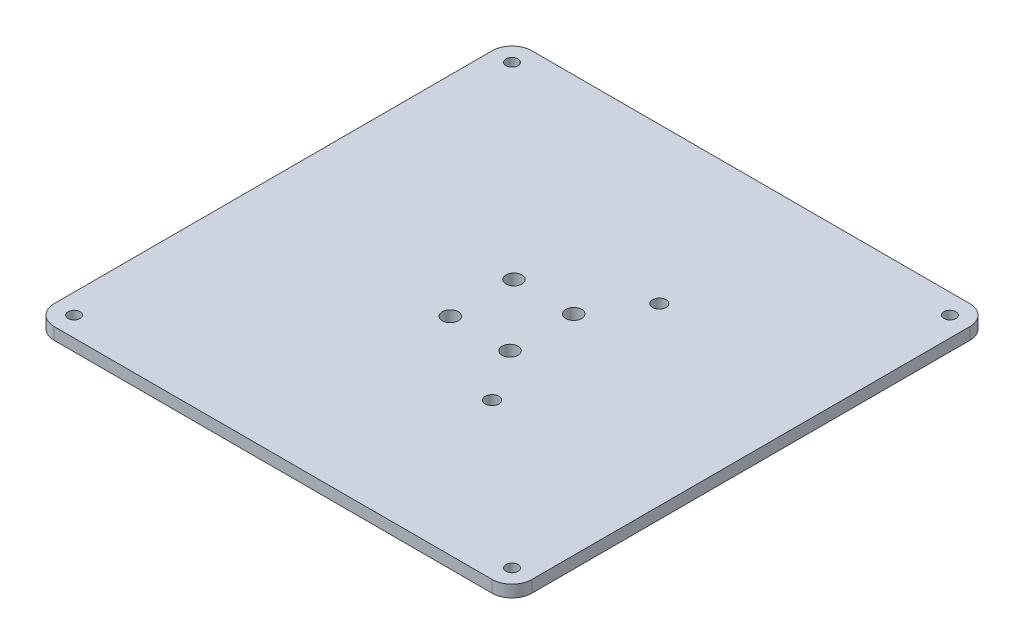
ISO-10303-21;
HEADER;
FILE_DESCRIPTION(('STEP AP214'),'2;1');
FILE_NAME('part.step','',(''),(''),'','','');
FILE_SCHEMA(('AUTOMOTIVE_DESIGN { 1 0 10303 214 1 1 1 1 }'));
ENDSEC;
DATA;
#1=APPLICATION_CONTEXT('core data for automotive mechanical design processes');
#2=APPLICATION_PROTOCOL_DEFINITION('international standard','automotive_design',2000,#1);
#3=PRODUCT_CONTEXT('',#1,'mechanical');
#4=PRODUCT('Part','Part','',(#3));
#5=PRODUCT_RELATED_PRODUCT_CATEGORY('part','',(#4));
#6=PRODUCT_DEFINITION_FORMATION('','',#4);
#7=PRODUCT_DEFINITION_CONTEXT('part definition',#1,'design');
#8=PRODUCT_DEFINITION('design','',#6,#7);
#9=PRODUCT_DEFINITION_SHAPE('','',#8);
#10=(LENGTH_UNIT() NAMED_UNIT(*) SI_UNIT(.MILLI.,.METRE.));
#11=(NAMED_UNIT(*) PLANE_ANGLE_UNIT() SI_UNIT($,.RADIAN.));
#12=(NAMED_UNIT(*) SI_UNIT($,.STERADIAN.) SOLID_ANGLE_UNIT());
#13=UNCERTAINTY_MEASURE_WITH_UNIT(LENGTH_MEASURE(1.E-05),#10,'distance_accuracy_value','');
#14=(GEOMETRIC_REPRESENTATION_CONTEXT(3) GLOBAL_UNCERTAINTY_ASSIGNED_CONTEXT((#13)) GLOBAL_UNIT_ASSIGNED_CONTEXT((#10,
#11,#12)) REPRESENTATION_CONTEXT('',''));
#15=CARTESIAN_POINT('',(0.,0.,0.));
#16=DIRECTION('',(0.,0.,1.));
#17=DIRECTION('',(1.,0.,0.));
#18=AXIS2_PLACEMENT_3D('',#15,#16,#17);
#19=CARTESIAN_POINT('',(0.,3.,0.));
#20=DIRECTION('',(0.,-1.,0.));
#21=DIRECTION('',(0.,0.,-1.));
#22=AXIS2_PLACEMENT_3D('',#19,#20,#21);
#23=PLANE('',#22);
#24=CARTESIAN_POINT('',(16.,3.,-21.));
#25=DIRECTION('',(0.,1.,0.));
#26=DIRECTION('',(0.,0.,1.));
#27=AXIS2_PLACEMENT_3D('',#24,#25,#26);
#28=CIRCLE('',#27,1.7);
#29=CARTESIAN_POINT('',(16.,3.,-19.3));
#30=VERTEX_POINT('',#29);
#31=EDGE_CURVE('E239',#30,#30,#28,.T.);
#32=ORIENTED_EDGE('',*,*,#31,.F.);
#33=EDGE_LOOP('',(#32));
#34=FACE_BOUND('',#33,.T.);
#35=CARTESIAN_POINT('',(16.,3.,21.));
#36=DIRECTION('',(0.,1.,0.));
#37=DIRECTION('',(0.,0.,1.));
#38=AXIS2_PLACEMENT_3D('',#35,#36,#37);
#39=CIRCLE('',#38,1.7);
#40=CARTESIAN_POINT('',(16.,3.,22.7));
#41=VERTEX_POINT('',#40);
#42=EDGE_CURVE('E236',#41,#41,#39,.T.);
#43=ORIENTED_EDGE('',*,*,#42,.F.);
#44=EDGE_LOOP('',(#43));
#45=FACE_BOUND('',#44,.T.);
#46=CARTESIAN_POINT('',(55.,3.,55.));
#47=DIRECTION('',(0.,1.,0.));
#48=DIRECTION('',(0.,0.,-1.));
#49=AXIS2_PLACEMENT_3D('',#46,#47,#48);
#50=CIRCLE('',#49,1.5);
#51=CARTESIAN_POINT('',(55.,3.,53.5));
#52=VERTEX_POINT('',#51);
#53=EDGE_CURVE('E227',#52,#52,#50,.T.);
#54=ORIENTED_EDGE('',*,*,#53,.F.);
#55=EDGE_LOOP('',(#54));
#56=FACE_BOUND('',#55,.T.);
#57=CARTESIAN_POINT('',(-55.,3.,55.));
#58=DIRECTION('',(0.,-1.,0.));
#59=DIRECTION('',(0.,0.,-1.));
#60=AXIS2_PLACEMENT_3D('',#57,#58,#59);
#61=CIRCLE('',#60,1.5);
#62=CARTESIAN_POINT('',(-55.,3.,53.5));
#63=VERTEX_POINT('',#62);
#64=EDGE_CURVE('E221',#63,#63,#61,.T.);
#65=ORIENTED_EDGE('',*,*,#64,.T.);
#66=EDGE_LOOP('',(#65));
#67=FACE_BOUND('',#66,.T.);
#68=CARTESIAN_POINT('',(55.,3.,-55.));
#69=DIRECTION('',(0.,-1.,0.));
#70=DIRECTION('',(0.,0.,1.));
#71=AXIS2_PLACEMENT_3D('',#68,#69,#70);
#72=CIRCLE('',#71,1.5);
#73=CARTESIAN_POINT('',(55.,3.,-53.5));
#74=VERTEX_POINT('',#73);
#75=EDGE_CURVE('E215',#74,#74,#72,.T.);
#76=ORIENTED_EDGE('',*,*,#75,.T.);
#77=EDGE_LOOP('',(#76));
#78=FACE_BOUND('',#77,.T.);
#79=CARTESIAN_POINT('',(-55.,3.,-55.));
#80=DIRECTION('',(0.,1.,0.));
#81=DIRECTION('',(0.,0.,1.));
#82=AXIS2_PLACEMENT_3D('',#79,#80,#81);
#83=CIRCLE('',#82,1.5);
#84=CARTESIAN_POINT('',(-55.,3.,-53.5));
#85=VERTEX_POINT('',#84);
#86=EDGE_CURVE('E209',#85,#85,#83,.T.);
#87=ORIENTED_EDGE('',*,*,#86,.F.);
#88=EDGE_LOOP('',(#87));
#89=FACE_BOUND('',#88,.T.);
#90=DIRECTION('',(-1.,0.,0.));
#91=VECTOR('',#90,1.);
#92=CARTESIAN_POINT('',(-60.,3.,-60.));
#93=LINE('',#92,#91);
#94=CARTESIAN_POINT('',(55.,3.,-60.));
#95=VERTEX_POINT('',#94);
#96=CARTESIAN_POINT('',(-55.,3.,-60.));
#97=VERTEX_POINT('',#96);
#98=EDGE_CURVE('E175',#95,#97,#93,.T.);
#99=ORIENTED_EDGE('',*,*,#98,.T.);
#100=CARTESIAN_POINT('',(-55.,3.,-55.));
#101=DIRECTION('',(0.,-1.,0.));
#102=DIRECTION('',(0.,0.,-1.));
#103=AXIS2_PLACEMENT_3D('',#100,#101,#102);
#104=CIRCLE('',#103,5.);
#105=CARTESIAN_POINT('',(-60.,3.,-55.));
#106=VERTEX_POINT('',#105);
#107=EDGE_CURVE('E153',#97,#106,#104,.F.);
#108=ORIENTED_EDGE('',*,*,#107,.T.);
#109=DIRECTION('',(0.,0.,1.));
#110=VECTOR('',#109,1.);
#111=CARTESIAN_POINT('',(-60.,3.,60.));
#112=LINE('',#111,#110);
#113=CARTESIAN_POINT('',(-60.,3.,55.));
#114=VERTEX_POINT('',#113);
#115=EDGE_CURVE('E123',#106,#114,#112,.T.);
#116=ORIENTED_EDGE('',*,*,#115,.T.);
#117=CARTESIAN_POINT('',(-55.,3.,55.));
#118=DIRECTION('',(0.,-1.,0.));
#119=DIRECTION('',(0.,0.,-1.));
#120=AXIS2_PLACEMENT_3D('',#117,#118,#119);
#121=CIRCLE('',#120,5.);
#122=CARTESIAN_POINT('',(-55.,3.,60.));
#123=VERTEX_POINT('',#122);
#124=EDGE_CURVE('E59',#114,#123,#121,.F.);
#125=ORIENTED_EDGE('',*,*,#124,.T.);
#126=DIRECTION('',(1.,0.,0.));
#127=VECTOR('',#126,1.);
#128=CARTESIAN_POINT('',(-60.,3.,60.));
#129=LINE('',#128,#127);
#130=CARTESIAN_POINT('',(55.,3.,60.));
#131=VERTEX_POINT('',#130);
#132=EDGE_CURVE('E139',#123,#131,#129,.T.);
#133=ORIENTED_EDGE('',*,*,#132,.T.);
#134=CARTESIAN_POINT('',(55.,3.,55.));
#135=DIRECTION('',(0.,-1.,0.));
#136=DIRECTION('',(0.,0.,-1.));
#137=AXIS2_PLACEMENT_3D('',#134,#135,#136);
#138=CIRCLE('',#137,5.);
#139=CARTESIAN_POINT('',(60.,3.,55.));
#140=VERTEX_POINT('',#139);
#141=EDGE_CURVE('E149',#131,#140,#138,.F.);
#142=ORIENTED_EDGE('',*,*,#141,.T.);
#143=DIRECTION('',(0.,0.,-1.));
#144=VECTOR('',#143,1.);
#145=CARTESIAN_POINT('',(60.,3.,60.));
#146=LINE('',#145,#144);
#147=CARTESIAN_POINT('',(60.,3.,-55.));
#148=VERTEX_POINT('',#147);
#149=EDGE_CURVE('E133',#140,#148,#146,.T.);
#150=ORIENTED_EDGE('',*,*,#149,.T.);
#151=CARTESIAN_POINT('',(55.,3.,-55.));
#152=DIRECTION('',(0.,-1.,0.));
#153=DIRECTION('',(0.,0.,-1.));
#154=AXIS2_PLACEMENT_3D('',#151,#152,#153);
#155=CIRCLE('',#154,5.);
#156=EDGE_CURVE('E151',#148,#95,#155,.F.);
#157=ORIENTED_EDGE('',*,*,#156,.T.);
#158=EDGE_LOOP('',(#99,#108,#116,#125,#133,#142,#150,#157));
#159=FACE_BOUND('',#158,.T.);
#160=CARTESIAN_POINT('',(-7.5,3.,8.));
#161=DIRECTION('',(0.,1.,0.));
#162=DIRECTION('',(0.,0.,1.));
#163=AXIS2_PLACEMENT_3D('',#160,#161,#162);
#164=CIRCLE('',#163,2.);
#165=CARTESIAN_POINT('',(-7.5,3.,10.));
#166=VERTEX_POINT('',#165);
#167=EDGE_CURVE('E184',#166,#166,#164,.T.);
#168=ORIENTED_EDGE('',*,*,#167,.F.);
#169=EDGE_LOOP('',(#168));
#170=FACE_BOUND('',#169,.T.);
#171=CARTESIAN_POINT('',(7.5,3.,-8.));
#172=DIRECTION('',(0.,1.,0.));
#173=DIRECTION('',(0.,0.,1.));
#174=AXIS2_PLACEMENT_3D('',#171,#172,#173);
#175=CIRCLE('',#174,2.);
#176=CARTESIAN_POINT('',(7.5,3.,-6.));
#177=VERTEX_POINT('',#176);
#178=EDGE_CURVE('E189',#177,#177,#175,.T.);
#179=ORIENTED_EDGE('',*,*,#178,.F.);
#180=EDGE_LOOP('',(#179));
#181=FACE_BOUND('',#180,.T.);
#182=CARTESIAN_POINT('',(7.5,3.,8.));
#183=DIRECTION('',(0.,1.,0.));
#184=DIRECTION('',(0.,0.,1.));
#185=AXIS2_PLACEMENT_3D('',#182,#183,#184);
#186=CIRCLE('',#185,2.);
#187=CARTESIAN_POINT('',(7.5,3.,10.));
#188=VERTEX_POINT('',#187);
#189=EDGE_CURVE('E194',#188,#188,#186,.T.);
#190=ORIENTED_EDGE('',*,*,#189,.F.);
#191=EDGE_LOOP('',(#190));
#192=FACE_BOUND('',#191,.T.);
#193=CARTESIAN_POINT('',(-7.5,3.,-8.));
#194=DIRECTION('',(0.,1.,0.));
#195=DIRECTION('',(0.,0.,1.));
#196=AXIS2_PLACEMENT_3D('',#193,#194,#195);
#197=CIRCLE('',#196,2.);
#198=CARTESIAN_POINT('',(-7.5,3.,-6.));
#199=VERTEX_POINT('',#198);
#200=EDGE_CURVE('E200',#199,#199,#197,.T.);
#201=ORIENTED_EDGE('',*,*,#200,.F.);
#202=EDGE_LOOP('',(#201));
#203=FACE_BOUND('',#202,.T.);
#204=ADVANCED_FACE('F39',(#34,#45,#56,#67,#78,#89,#159,#170,#181,#192,#203),#23,.F.);
#205=CARTESIAN_POINT('',(0.,0.,0.));
#206=DIRECTION('',(0.,-1.,0.));
#207=DIRECTION('',(0.,0.,-1.));
#208=AXIS2_PLACEMENT_3D('',#205,#206,#207);
#209=PLANE('',#208);
#210=CARTESIAN_POINT('',(16.,0.,-21.));
#211=DIRECTION('',(0.,1.,0.));
#212=DIRECTION('',(0.,0.,1.));
#213=AXIS2_PLACEMENT_3D('',#210,#211,#212);
#214=CIRCLE('',#213,1.7);
#215=CARTESIAN_POINT('',(16.,0.,-19.3));
#216=VERTEX_POINT('',#215);
#217=EDGE_CURVE('E230',#216,#216,#214,.T.);
#218=ORIENTED_EDGE('',*,*,#217,.T.);
#219=EDGE_LOOP('',(#218));
#220=FACE_BOUND('',#219,.T.);
#221=CARTESIAN_POINT('',(16.,0.,21.));
#222=DIRECTION('',(0.,1.,0.));
#223=DIRECTION('',(0.,0.,1.));
#224=AXIS2_PLACEMENT_3D('',#221,#222,#223);
#225=CIRCLE('',#224,1.7);
#226=CARTESIAN_POINT('',(16.,0.,22.7));
#227=VERTEX_POINT('',#226);
#228=EDGE_CURVE('E233',#227,#227,#225,.T.);
#229=ORIENTED_EDGE('',*,*,#228,.T.);
#230=EDGE_LOOP('',(#229));
#231=FACE_BOUND('',#230,.T.);
#232=CARTESIAN_POINT('',(55.,0.,55.));
#233=DIRECTION('',(0.,1.,0.));
#234=DIRECTION('',(0.,0.,-1.));
#235=AXIS2_PLACEMENT_3D('',#232,#233,#234);
#236=CIRCLE('',#235,1.5);
#237=CARTESIAN_POINT('',(55.,0.,53.5));
#238=VERTEX_POINT('',#237);
#239=EDGE_CURVE('E224',#238,#238,#236,.T.);
#240=ORIENTED_EDGE('',*,*,#239,.T.);
#241=EDGE_LOOP('',(#240));
#242=FACE_BOUND('',#241,.T.);
#243=CARTESIAN_POINT('',(-55.,0.,55.));
#244=DIRECTION('',(0.,-1.,0.));
#245=DIRECTION('',(0.,0.,-1.));
#246=AXIS2_PLACEMENT_3D('',#243,#244,#245);
#247=CIRCLE('',#246,1.5);
#248=CARTESIAN_POINT('',(-55.,0.,53.5));
#249=VERTEX_POINT('',#248);
#250=EDGE_CURVE('E218',#249,#249,#247,.T.);
#251=ORIENTED_EDGE('',*,*,#250,.F.);
#252=EDGE_LOOP('',(#251));
#253=FACE_BOUND('',#252,.T.);
#254=CARTESIAN_POINT('',(55.,0.,-55.));
#255=DIRECTION('',(0.,-1.,0.));
#256=DIRECTION('',(0.,0.,1.));
#257=AXIS2_PLACEMENT_3D('',#254,#255,#256);
#258=CIRCLE('',#257,1.5);
#259=CARTESIAN_POINT('',(55.,0.,-53.5));
#260=VERTEX_POINT('',#259);
#261=EDGE_CURVE('E212',#260,#260,#258,.T.);
#262=ORIENTED_EDGE('',*,*,#261,.F.);
#263=EDGE_LOOP('',(#262));
#264=FACE_BOUND('',#263,.T.);
#265=CARTESIAN_POINT('',(-55.,0.,-55.));
#266=DIRECTION('',(0.,1.,0.));
#267=DIRECTION('',(0.,0.,1.));
#268=AXIS2_PLACEMENT_3D('',#265,#266,#267);
#269=CIRCLE('',#268,1.5);
#270=CARTESIAN_POINT('',(-55.,0.,-53.5));
#271=VERTEX_POINT('',#270);
#272=EDGE_CURVE('E206',#271,#271,#269,.T.);
#273=ORIENTED_EDGE('',*,*,#272,.T.);
#274=EDGE_LOOP('',(#273));
#275=FACE_BOUND('',#274,.T.);
#276=CARTESIAN_POINT('',(7.5,0.,8.));
#277=DIRECTION('',(0.,1.,0.));
#278=DIRECTION('',(0.,0.,1.));
#279=AXIS2_PLACEMENT_3D('',#276,#277,#278);
#280=CIRCLE('',#279,2.);
#281=CARTESIAN_POINT('',(7.5,0.,10.));
#282=VERTEX_POINT('',#281);
#283=EDGE_CURVE('E197',#282,#282,#280,.T.);
#284=ORIENTED_EDGE('',*,*,#283,.T.);
#285=EDGE_LOOP('',(#284));
#286=FACE_BOUND('',#285,.T.);
#287=CARTESIAN_POINT('',(-7.5,0.,8.));
#288=DIRECTION('',(0.,1.,0.));
#289=DIRECTION('',(0.,0.,1.));
#290=AXIS2_PLACEMENT_3D('',#287,#288,#289);
#291=CIRCLE('',#290,2.);
#292=CARTESIAN_POINT('',(-7.5,0.,10.));
#293=VERTEX_POINT('',#292);
#294=EDGE_CURVE('E180',#293,#293,#291,.T.);
#295=ORIENTED_EDGE('',*,*,#294,.T.);
#296=EDGE_LOOP('',(#295));
#297=FACE_BOUND('',#296,.T.);
#298=DIRECTION('',(0.,0.,1.));
#299=VECTOR('',#298,1.);
#300=CARTESIAN_POINT('',(-60.,0.,60.));
#301=LINE('',#300,#299);
#302=CARTESIAN_POINT('',(-60.,0.,-55.));
#303=VERTEX_POINT('',#302);
#304=CARTESIAN_POINT('',(-60.,0.,55.));
#305=VERTEX_POINT('',#304);
#306=EDGE_CURVE('E121',#303,#305,#301,.T.);
#307=ORIENTED_EDGE('',*,*,#306,.F.);
#308=CARTESIAN_POINT('',(-55.,0.,-55.));
#309=DIRECTION('',(0.,-1.,0.));
#310=DIRECTION('',(0.,0.,-1.));
#311=AXIS2_PLACEMENT_3D('',#308,#309,#310);
#312=CIRCLE('',#311,5.);
#313=CARTESIAN_POINT('',(-55.,0.,-60.));
#314=VERTEX_POINT('',#313);
#315=EDGE_CURVE('E104',#303,#314,#312,.T.);
#316=ORIENTED_EDGE('',*,*,#315,.T.);
#317=DIRECTION('',(-1.,0.,0.));
#318=VECTOR('',#317,1.);
#319=CARTESIAN_POINT('',(-60.,0.,-60.));
#320=LINE('',#319,#318);
#321=CARTESIAN_POINT('',(55.,0.,-60.));
#322=VERTEX_POINT('',#321);
#323=EDGE_CURVE('E131',#322,#314,#320,.T.);
#324=ORIENTED_EDGE('',*,*,#323,.F.);
#325=CARTESIAN_POINT('',(55.,0.,-55.));
#326=DIRECTION('',(0.,-1.,0.));
#327=DIRECTION('',(0.,0.,-1.));
#328=AXIS2_PLACEMENT_3D('',#325,#326,#327);
#329=CIRCLE('',#328,5.);
#330=CARTESIAN_POINT('',(60.,0.,-55.));
#331=VERTEX_POINT('',#330);
#332=EDGE_CURVE('E115',#322,#331,#329,.T.);
#333=ORIENTED_EDGE('',*,*,#332,.T.);
#334=DIRECTION('',(0.,0.,-1.));
#335=VECTOR('',#334,1.);
#336=CARTESIAN_POINT('',(60.,0.,60.));
#337=LINE('',#336,#335);
#338=CARTESIAN_POINT('',(60.,0.,55.));
#339=VERTEX_POINT('',#338);
#340=EDGE_CURVE('E135',#339,#331,#337,.T.);
#341=ORIENTED_EDGE('',*,*,#340,.F.);
#342=CARTESIAN_POINT('',(55.,0.,55.));
#343=DIRECTION('',(0.,-1.,0.));
#344=DIRECTION('',(0.,0.,-1.));
#345=AXIS2_PLACEMENT_3D('',#342,#343,#344);
#346=CIRCLE('',#345,5.);
#347=CARTESIAN_POINT('',(55.,0.,60.));
#348=VERTEX_POINT('',#347);
#349=EDGE_CURVE('E142',#339,#348,#346,.T.);
#350=ORIENTED_EDGE('',*,*,#349,.T.);
#351=DIRECTION('',(1.,0.,0.));
#352=VECTOR('',#351,1.);
#353=CARTESIAN_POINT('',(-60.,0.,60.));
#354=LINE('',#353,#352);
#355=CARTESIAN_POINT('',(-55.,0.,60.));
#356=VERTEX_POINT('',#355);
#357=EDGE_CURVE('E130',#356,#348,#354,.T.);
#358=ORIENTED_EDGE('',*,*,#357,.F.);
#359=CARTESIAN_POINT('',(-55.,0.,55.));
#360=DIRECTION('',(0.,-1.,0.));
#361=DIRECTION('',(0.,0.,-1.));
#362=AXIS2_PLACEMENT_3D('',#359,#360,#361);
#363=CIRCLE('',#362,5.);
#364=EDGE_CURVE('E124',#356,#305,#363,.T.);
#365=ORIENTED_EDGE('',*,*,#364,.T.);
#366=EDGE_LOOP('',(#307,#316,#324,#333,#341,#350,#358,#365));
#367=FACE_BOUND('',#366,.T.);
#368=CARTESIAN_POINT('',(7.5,0.,-8.));
#369=DIRECTION('',(0.,1.,0.));
#370=DIRECTION('',(0.,0.,1.));
#371=AXIS2_PLACEMENT_3D('',#368,#369,#370);
#372=CIRCLE('',#371,2.);
#373=CARTESIAN_POINT('',(7.5,0.,-6.));
#374=VERTEX_POINT('',#373);
#375=EDGE_CURVE('E191',#374,#374,#372,.T.);
#376=ORIENTED_EDGE('',*,*,#375,.T.);
#377=EDGE_LOOP('',(#376));
#378=FACE_BOUND('',#377,.T.);
#379=CARTESIAN_POINT('',(-7.5,0.,-8.));
#380=DIRECTION('',(0.,1.,0.));
#381=DIRECTION('',(0.,0.,1.));
#382=AXIS2_PLACEMENT_3D('',#379,#380,#381);
#383=CIRCLE('',#382,2.);
#384=CARTESIAN_POINT('',(-7.5,0.,-6.));
#385=VERTEX_POINT('',#384);
#386=EDGE_CURVE('E203',#385,#385,#383,.T.);
#387=ORIENTED_EDGE('',*,*,#386,.T.);
#388=EDGE_LOOP('',(#387));
#389=FACE_BOUND('',#388,.T.);
#390=ADVANCED_FACE('F127',(#220,#231,#242,#253,#264,#275,#286,#297,#367,#378,#389),#209,.T.);
#391=CARTESIAN_POINT('',(60.,3.,60.));
#392=DIRECTION('',(-1.,0.,0.));
#393=DIRECTION('',(0.,0.,1.));
#394=AXIS2_PLACEMENT_3D('',#391,#392,#393);
#395=PLANE('',#394);
#396=ORIENTED_EDGE('',*,*,#340,.T.);
#397=DIRECTION('',(0.,-1.,0.));
#398=VECTOR('',#397,1.);
#399=CARTESIAN_POINT('',(60.,3.,-55.));
#400=LINE('',#399,#398);
#401=EDGE_CURVE('E158',#331,#148,#400,.F.);
#402=ORIENTED_EDGE('',*,*,#401,.T.);
#403=ORIENTED_EDGE('',*,*,#149,.F.);
#404=DIRECTION('',(0.,-1.,0.));
#405=VECTOR('',#404,1.);
#406=CARTESIAN_POINT('',(60.,3.,55.));
#407=LINE('',#406,#405);
#408=EDGE_CURVE('E155',#140,#339,#407,.T.);
#409=ORIENTED_EDGE('',*,*,#408,.T.);
#410=EDGE_LOOP('',(#396,#402,#403,#409));
#411=FACE_BOUND('',#410,.T.);
#412=ADVANCED_FACE('F171',(#411),#395,.F.);
#413=CARTESIAN_POINT('',(-60.,3.,-60.));
#414=DIRECTION('',(0.,0.,1.));
#415=DIRECTION('',(1.,0.,0.));
#416=AXIS2_PLACEMENT_3D('',#413,#414,#415);
#417=PLANE('',#416);
#418=ORIENTED_EDGE('',*,*,#323,.T.);
#419=DIRECTION('',(0.,-1.,0.));
#420=VECTOR('',#419,1.);
#421=CARTESIAN_POINT('',(-55.,3.,-60.));
#422=LINE('',#421,#420);
#423=EDGE_CURVE('E109',#314,#97,#422,.F.);
#424=ORIENTED_EDGE('',*,*,#423,.T.);
#425=ORIENTED_EDGE('',*,*,#98,.F.);
#426=DIRECTION('',(0.,-1.,0.));
#427=VECTOR('',#426,1.);
#428=CARTESIAN_POINT('',(55.,3.,-60.));
#429=LINE('',#428,#427);
#430=EDGE_CURVE('E114',#95,#322,#429,.T.);
#431=ORIENTED_EDGE('',*,*,#430,.T.);
#432=EDGE_LOOP('',(#418,#424,#425,#431));
#433=FACE_BOUND('',#432,.T.);
#434=ADVANCED_FACE('F287',(#433),#417,.F.);
#435=CARTESIAN_POINT('',(-60.,3.,60.));
#436=DIRECTION('',(1.,0.,0.));
#437=DIRECTION('',(0.,0.,-1.));
#438=AXIS2_PLACEMENT_3D('',#435,#436,#437);
#439=PLANE('',#438);
#440=ORIENTED_EDGE('',*,*,#115,.F.);
#441=DIRECTION('',(0.,-1.,0.));
#442=VECTOR('',#441,1.);
#443=CARTESIAN_POINT('',(-60.,3.,-55.));
#444=LINE('',#443,#442);
#445=EDGE_CURVE('E108',#106,#303,#444,.T.);
#446=ORIENTED_EDGE('',*,*,#445,.T.);
#447=ORIENTED_EDGE('',*,*,#306,.T.);
#448=DIRECTION('',(0.,-1.,0.));
#449=VECTOR('',#448,1.);
#450=CARTESIAN_POINT('',(-60.,3.,55.));
#451=LINE('',#450,#449);
#452=EDGE_CURVE('E125',#305,#114,#451,.F.);
#453=ORIENTED_EDGE('',*,*,#452,.T.);
#454=EDGE_LOOP('',(#440,#446,#447,#453));
#455=FACE_BOUND('',#454,.T.);
#456=ADVANCED_FACE('F120',(#455),#439,.F.);
#457=CARTESIAN_POINT('',(-60.,3.,60.));
#458=DIRECTION('',(0.,0.,-1.));
#459=DIRECTION('',(-1.,0.,0.));
#460=AXIS2_PLACEMENT_3D('',#457,#458,#459);
#461=PLANE('',#460);
#462=ORIENTED_EDGE('',*,*,#357,.T.);
#463=DIRECTION('',(0.,-1.,0.));
#464=VECTOR('',#463,1.);
#465=CARTESIAN_POINT('',(55.,3.,60.));
#466=LINE('',#465,#464);
#467=EDGE_CURVE('E11',#348,#131,#466,.F.);
#468=ORIENTED_EDGE('',*,*,#467,.T.);
#469=ORIENTED_EDGE('',*,*,#132,.F.);
#470=DIRECTION('',(0.,-1.,0.));
#471=VECTOR('',#470,1.);
#472=CARTESIAN_POINT('',(-55.,3.,60.));
#473=LINE('',#472,#471);
#474=EDGE_CURVE('E47',#123,#356,#473,.T.);
#475=ORIENTED_EDGE('',*,*,#474,.T.);
#476=EDGE_LOOP('',(#462,#468,#469,#475));
#477=FACE_BOUND('',#476,.T.);
#478=ADVANCED_FACE('F161',(#477),#461,.F.);
#479=CARTESIAN_POINT('',(-7.5,3.,8.));
#480=DIRECTION('',(0.,-1.,0.));
#481=DIRECTION('',(0.,0.,-1.));
#482=AXIS2_PLACEMENT_3D('',#479,#480,#481);
#483=CYLINDRICAL_SURFACE('',#482,2.);
#484=ORIENTED_EDGE('',*,*,#167,.T.);
#485=EDGE_LOOP('',(#484));
#486=FACE_BOUND('',#485,.T.);
#487=ORIENTED_EDGE('',*,*,#294,.F.);
#488=EDGE_LOOP('',(#487));
#489=FACE_BOUND('',#488,.T.);
#490=ADVANCED_FACE('F293',(#486,#489),#483,.F.);
#491=CARTESIAN_POINT('',(7.5,3.,-8.));
#492=DIRECTION('',(0.,-1.,0.));
#493=DIRECTION('',(0.,0.,-1.));
#494=AXIS2_PLACEMENT_3D('',#491,#492,#493);
#495=CYLINDRICAL_SURFACE('',#494,2.);
#496=ORIENTED_EDGE('',*,*,#178,.T.);
#497=EDGE_LOOP('',(#496));
#498=FACE_BOUND('',#497,.T.);
#499=ORIENTED_EDGE('',*,*,#375,.F.);
#500=EDGE_LOOP('',(#499));
#501=FACE_BOUND('',#500,.T.);
#502=ADVANCED_FACE('F327',(#498,#501),#495,.F.);
#503=CARTESIAN_POINT('',(7.5,3.,8.));
#504=DIRECTION('',(0.,-1.,0.));
#505=DIRECTION('',(0.,0.,-1.));
#506=AXIS2_PLACEMENT_3D('',#503,#504,#505);
#507=CYLINDRICAL_SURFACE('',#506,2.);
#508=ORIENTED_EDGE('',*,*,#189,.T.);
#509=EDGE_LOOP('',(#508));
#510=FACE_BOUND('',#509,.T.);
#511=ORIENTED_EDGE('',*,*,#283,.F.);
#512=EDGE_LOOP('',(#511));
#513=FACE_BOUND('',#512,.T.);
#514=ADVANCED_FACE('F278',(#510,#513),#507,.F.);
#515=CARTESIAN_POINT('',(-7.5,3.,-8.));
#516=DIRECTION('',(0.,-1.,0.));
#517=DIRECTION('',(0.,0.,-1.));
#518=AXIS2_PLACEMENT_3D('',#515,#516,#517);
#519=CYLINDRICAL_SURFACE('',#518,2.);
#520=ORIENTED_EDGE('',*,*,#200,.T.);
#521=EDGE_LOOP('',(#520));
#522=FACE_BOUND('',#521,.T.);
#523=ORIENTED_EDGE('',*,*,#386,.F.);
#524=EDGE_LOOP('',(#523));
#525=FACE_BOUND('',#524,.T.);
#526=ADVANCED_FACE('F275',(#522,#525),#519,.F.);
#527=CARTESIAN_POINT('',(-55.,3.,-55.));
#528=DIRECTION('',(0.,-1.,0.));
#529=DIRECTION('',(0.,0.,-1.));
#530=AXIS2_PLACEMENT_3D('',#527,#528,#529);
#531=CYLINDRICAL_SURFACE('',#530,5.);
#532=ORIENTED_EDGE('',*,*,#107,.F.);
#533=ORIENTED_EDGE('',*,*,#423,.F.);
#534=ORIENTED_EDGE('',*,*,#315,.F.);
#535=ORIENTED_EDGE('',*,*,#445,.F.);
#536=EDGE_LOOP('',(#532,#533,#534,#535));
#537=FACE_BOUND('',#536,.T.);
#538=ADVANCED_FACE('F107',(#537),#531,.T.);
#539=CARTESIAN_POINT('',(55.,3.,-55.));
#540=DIRECTION('',(0.,-1.,0.));
#541=DIRECTION('',(0.,0.,-1.));
#542=AXIS2_PLACEMENT_3D('',#539,#540,#541);
#543=CYLINDRICAL_SURFACE('',#542,5.);
#544=ORIENTED_EDGE('',*,*,#156,.F.);
#545=ORIENTED_EDGE('',*,*,#401,.F.);
#546=ORIENTED_EDGE('',*,*,#332,.F.);
#547=ORIENTED_EDGE('',*,*,#430,.F.);
#548=EDGE_LOOP('',(#544,#545,#546,#547));
#549=FACE_BOUND('',#548,.T.);
#550=ADVANCED_FACE('F301',(#549),#543,.T.);
#551=CARTESIAN_POINT('',(55.,3.,55.));
#552=DIRECTION('',(0.,-1.,0.));
#553=DIRECTION('',(0.,0.,-1.));
#554=AXIS2_PLACEMENT_3D('',#551,#552,#553);
#555=CYLINDRICAL_SURFACE('',#554,5.);
#556=ORIENTED_EDGE('',*,*,#141,.F.);
#557=ORIENTED_EDGE('',*,*,#467,.F.);
#558=ORIENTED_EDGE('',*,*,#349,.F.);
#559=ORIENTED_EDGE('',*,*,#408,.F.);
#560=EDGE_LOOP('',(#556,#557,#558,#559));
#561=FACE_BOUND('',#560,.T.);
#562=ADVANCED_FACE('F168',(#561),#555,.T.);
#563=CARTESIAN_POINT('',(-55.,3.,55.));
#564=DIRECTION('',(0.,-1.,0.));
#565=DIRECTION('',(0.,0.,-1.));
#566=AXIS2_PLACEMENT_3D('',#563,#564,#565);
#567=CYLINDRICAL_SURFACE('',#566,5.);
#568=ORIENTED_EDGE('',*,*,#124,.F.);
#569=ORIENTED_EDGE('',*,*,#452,.F.);
#570=ORIENTED_EDGE('',*,*,#364,.F.);
#571=ORIENTED_EDGE('',*,*,#474,.F.);
#572=EDGE_LOOP('',(#568,#569,#570,#571));
#573=FACE_BOUND('',#572,.T.);
#574=ADVANCED_FACE('F41',(#573),#567,.T.);
#575=CARTESIAN_POINT('',(-55.,0.,-55.));
#576=DIRECTION('',(0.,1.,0.));
#577=DIRECTION('',(0.,0.,1.));
#578=AXIS2_PLACEMENT_3D('',#575,#576,#577);
#579=CYLINDRICAL_SURFACE('',#578,1.5);
#580=ORIENTED_EDGE('',*,*,#272,.F.);
#581=EDGE_LOOP('',(#580));
#582=FACE_BOUND('',#581,.T.);
#583=ORIENTED_EDGE('',*,*,#86,.T.);
#584=EDGE_LOOP('',(#583));
#585=FACE_BOUND('',#584,.T.);
#586=ADVANCED_FACE('F308',(#582,#585),#579,.F.);
#587=CARTESIAN_POINT('',(55.,0.,-55.));
#588=DIRECTION('',(0.,1.,0.));
#589=DIRECTION('',(0.,0.,1.));
#590=AXIS2_PLACEMENT_3D('',#587,#588,#589);
#591=CYLINDRICAL_SURFACE('',#590,1.5);
#592=ORIENTED_EDGE('',*,*,#261,.T.);
#593=EDGE_LOOP('',(#592));
#594=FACE_BOUND('',#593,.T.);
#595=ORIENTED_EDGE('',*,*,#75,.F.);
#596=EDGE_LOOP('',(#595));
#597=FACE_BOUND('',#596,.T.);
#598=ADVANCED_FACE('F312',(#594,#597),#591,.F.);
#599=CARTESIAN_POINT('',(-55.,0.,55.));
#600=DIRECTION('',(0.,1.,0.));
#601=DIRECTION('',(0.,0.,1.));
#602=AXIS2_PLACEMENT_3D('',#599,#600,#601);
#603=CYLINDRICAL_SURFACE('',#602,1.5);
#604=ORIENTED_EDGE('',*,*,#250,.T.);
#605=EDGE_LOOP('',(#604));
#606=FACE_BOUND('',#605,.T.);
#607=ORIENTED_EDGE('',*,*,#64,.F.);
#608=EDGE_LOOP('',(#607));
#609=FACE_BOUND('',#608,.T.);
#610=ADVANCED_FACE('F318',(#606,#609),#603,.F.);
#611=CARTESIAN_POINT('',(55.,0.,55.));
#612=DIRECTION('',(0.,1.,0.));
#613=DIRECTION('',(0.,0.,1.));
#614=AXIS2_PLACEMENT_3D('',#611,#612,#613);
#615=CYLINDRICAL_SURFACE('',#614,1.5);
#616=ORIENTED_EDGE('',*,*,#239,.F.);
#617=EDGE_LOOP('',(#616));
#618=FACE_BOUND('',#617,.T.);
#619=ORIENTED_EDGE('',*,*,#53,.T.);
#620=EDGE_LOOP('',(#619));
#621=FACE_BOUND('',#620,.T.);
#622=ADVANCED_FACE('F392',(#618,#621),#615,.F.);
#623=CARTESIAN_POINT('',(16.,0.,21.));
#624=DIRECTION('',(0.,1.,0.));
#625=DIRECTION('',(0.,0.,1.));
#626=AXIS2_PLACEMENT_3D('',#623,#624,#625);
#627=CYLINDRICAL_SURFACE('',#626,1.7);
#628=ORIENTED_EDGE('',*,*,#228,.F.);
#629=EDGE_LOOP('',(#628));
#630=FACE_BOUND('',#629,.T.);
#631=ORIENTED_EDGE('',*,*,#42,.T.);
#632=EDGE_LOOP('',(#631));
#633=FACE_BOUND('',#632,.T.);
#634=ADVANCED_FACE('F250',(#630,#633),#627,.F.);
#635=CARTESIAN_POINT('',(16.,0.,-21.));
#636=DIRECTION('',(0.,1.,0.));
#637=DIRECTION('',(0.,0.,1.));
#638=AXIS2_PLACEMENT_3D('',#635,#636,#637);
#639=CYLINDRICAL_SURFACE('',#638,1.7);
#640=ORIENTED_EDGE('',*,*,#217,.F.);
#641=EDGE_LOOP('',(#640));
#642=FACE_BOUND('',#641,.T.);
#643=ORIENTED_EDGE('',*,*,#31,.T.);
#644=EDGE_LOOP('',(#643));
#645=FACE_BOUND('',#644,.T.);
#646=ADVANCED_FACE('F247',(#642,#645),#639,.F.);
#647=CLOSED_SHELL('',(#204,#390,#412,#434,#456,#478,#490,#502,#514,#526,#538,#550,#562,#574,
#586,#598,#610,#622,#634,#646));
#648=MANIFOLD_SOLID_BREP('B2',#647);
#649=ADVANCED_BREP_SHAPE_REPRESENTATION('',(#18,#648),#14);
#650=SHAPE_DEFINITION_REPRESENTATION(#9,#649);
ENDSEC;
END-ISO-10303-21;
